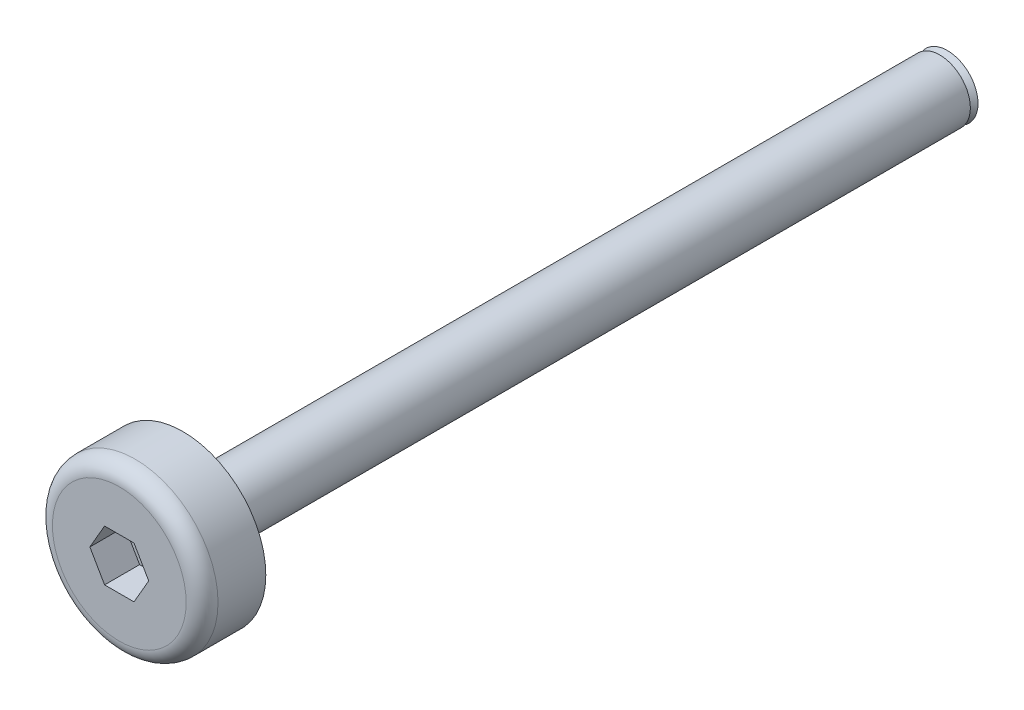
ISO-10303-21;
HEADER;
FILE_DESCRIPTION(('STEP AP214'),'2;1');
FILE_NAME('part.step','',(''),(''),'','','');
FILE_SCHEMA(('AUTOMOTIVE_DESIGN { 1 0 10303 214 1 1 1 1 }'));
ENDSEC;
DATA;
#1=APPLICATION_CONTEXT('core data for automotive mechanical design processes');
#2=APPLICATION_PROTOCOL_DEFINITION('international standard','automotive_design',2000,#1);
#3=PRODUCT_CONTEXT('',#1,'mechanical');
#4=PRODUCT('Part','Part','',(#3));
#5=PRODUCT_RELATED_PRODUCT_CATEGORY('part','',(#4));
#6=PRODUCT_DEFINITION_FORMATION('','',#4);
#7=PRODUCT_DEFINITION_CONTEXT('part definition',#1,'design');
#8=PRODUCT_DEFINITION('design','',#6,#7);
#9=PRODUCT_DEFINITION_SHAPE('','',#8);
#10=(LENGTH_UNIT() NAMED_UNIT(*) SI_UNIT(.MILLI.,.METRE.));
#11=(NAMED_UNIT(*) PLANE_ANGLE_UNIT() SI_UNIT($,.RADIAN.));
#12=(NAMED_UNIT(*) SI_UNIT($,.STERADIAN.) SOLID_ANGLE_UNIT());
#13=UNCERTAINTY_MEASURE_WITH_UNIT(LENGTH_MEASURE(1.E-05),#10,'distance_accuracy_value','');
#14=(GEOMETRIC_REPRESENTATION_CONTEXT(3) GLOBAL_UNCERTAINTY_ASSIGNED_CONTEXT((#13)) GLOBAL_UNIT_ASSIGNED_CONTEXT((#10,
#11,#12)) REPRESENTATION_CONTEXT('',''));
#15=CARTESIAN_POINT('',(0.,0.,0.));
#16=DIRECTION('',(0.,0.,1.));
#17=DIRECTION('',(1.,0.,0.));
#18=AXIS2_PLACEMENT_3D('',#15,#16,#17);
#19=CARTESIAN_POINT('',(0.,0.,-30.));
#20=DIRECTION('',(0.,0.,1.));
#21=DIRECTION('',(1.,0.,0.));
#22=AXIS2_PLACEMENT_3D('',#19,#20,#21);
#23=PLANE('',#22);
#24=CARTESIAN_POINT('',(0.,0.,-30.));
#25=DIRECTION('',(0.,0.,1.));
#26=DIRECTION('',(1.,0.,0.));
#27=AXIS2_PLACEMENT_3D('',#24,#25,#26);
#28=CIRCLE('',#27,1.2);
#29=CARTESIAN_POINT('',(1.2,0.,-30.));
#30=VERTEX_POINT('',#29);
#31=EDGE_CURVE('E9',#30,#30,#28,.T.);
#32=ORIENTED_EDGE('',*,*,#31,.F.);
#33=EDGE_LOOP('',(#32));
#34=FACE_BOUND('',#33,.T.);
#35=ADVANCED_FACE('F14',(#34),#23,.F.);
#36=CARTESIAN_POINT('',(0.,0.,-30.));
#37=DIRECTION('',(0.,0.,-1.));
#38=DIRECTION('',(1.,0.,0.));
#39=AXIS2_PLACEMENT_3D('',#36,#37,#38);
#40=CONICAL_SURFACE('',#39,1.2,0.785398163397);
#41=CARTESIAN_POINT('',(0.,0.,-29.7));
#42=DIRECTION('',(0.,0.,1.));
#43=DIRECTION('',(1.,0.,0.));
#44=AXIS2_PLACEMENT_3D('',#41,#42,#43);
#45=CIRCLE('',#44,0.9);
#46=CARTESIAN_POINT('',(0.9,0.,-29.7));
#47=VERTEX_POINT('',#46);
#48=EDGE_CURVE('E104',#47,#47,#45,.T.);
#49=ORIENTED_EDGE('',*,*,#48,.F.);
#50=DIRECTION('',(-0.707106781186548,0.,0.707106781186548));
#51=VECTOR('',#50,1.);
#52=CARTESIAN_POINT('',(1.2,0.,-30.));
#53=LINE('',#52,#51);
#54=EDGE_CURVE('E25',#30,#47,#53,.T.);
#55=ORIENTED_EDGE('',*,*,#54,.F.);
#56=ORIENTED_EDGE('',*,*,#31,.T.);
#57=ORIENTED_EDGE('',*,*,#54,.T.);
#58=EDGE_LOOP('',(#49,#55,#56,#57));
#59=FACE_BOUND('',#58,.T.);
#60=ADVANCED_FACE('F265',(#59),#40,.T.);
#61=CARTESIAN_POINT('',(0.,0.,1.125));
#62=DIRECTION('',(0.,0.,1.));
#63=DIRECTION('',(1.,0.,0.));
#64=AXIS2_PLACEMENT_3D('',#61,#62,#63);
#65=PLANE('',#64);
#66=DIRECTION('',(-0.50000000000019,0.866025403784329,0.));
#67=VECTOR('',#66,1.);
#68=CARTESIAN_POINT('',(1.154700538379,0.,1.125));
#69=LINE('',#68,#67);
#70=CARTESIAN_POINT('',(1.154700538379,0.,1.125));
#71=VERTEX_POINT('',#70);
#72=CARTESIAN_POINT('',(0.57735026919,1.,1.125));
#73=VERTEX_POINT('',#72);
#74=EDGE_CURVE('E197',#71,#73,#69,.T.);
#75=ORIENTED_EDGE('',*,*,#74,.T.);
#76=DIRECTION('',(-1.,0.,0.));
#77=VECTOR('',#76,1.);
#78=CARTESIAN_POINT('',(0.57735026919,1.,1.125));
#79=LINE('',#78,#77);
#80=CARTESIAN_POINT('',(-0.57735026919,1.,1.125));
#81=VERTEX_POINT('',#80);
#82=EDGE_CURVE('E121',#73,#81,#79,.T.);
#83=ORIENTED_EDGE('',*,*,#82,.T.);
#84=DIRECTION('',(-0.50000000000019,-0.866025403784329,0.));
#85=VECTOR('',#84,1.);
#86=CARTESIAN_POINT('',(-0.57735026919,1.,1.125));
#87=LINE('',#86,#85);
#88=CARTESIAN_POINT('',(-1.154700538379,0.,1.125));
#89=VERTEX_POINT('',#88);
#90=EDGE_CURVE('E161',#81,#89,#87,.T.);
#91=ORIENTED_EDGE('',*,*,#90,.T.);
#92=DIRECTION('',(0.50000000000019,-0.866025403784329,0.));
#93=VECTOR('',#92,1.);
#94=CARTESIAN_POINT('',(-1.154700538379,0.,1.125));
#95=LINE('',#94,#93);
#96=CARTESIAN_POINT('',(-0.57735026919,-1.,1.125));
#97=VERTEX_POINT('',#96);
#98=EDGE_CURVE('E166',#89,#97,#95,.T.);
#99=ORIENTED_EDGE('',*,*,#98,.T.);
#100=DIRECTION('',(1.,0.,0.));
#101=VECTOR('',#100,1.);
#102=CARTESIAN_POINT('',(-0.57735026919,-1.,1.125));
#103=LINE('',#102,#101);
#104=CARTESIAN_POINT('',(0.57735026919,-1.,1.125));
#105=VERTEX_POINT('',#104);
#106=EDGE_CURVE('E117',#97,#105,#103,.T.);
#107=ORIENTED_EDGE('',*,*,#106,.T.);
#108=DIRECTION('',(0.50000000000019,0.866025403784329,0.));
#109=VECTOR('',#108,1.);
#110=CARTESIAN_POINT('',(0.57735026919,-1.,1.125));
#111=LINE('',#110,#109);
#112=EDGE_CURVE('E116',#105,#71,#111,.T.);
#113=ORIENTED_EDGE('',*,*,#112,.T.);
#114=EDGE_LOOP('',(#75,#83,#91,#99,#107,#113));
#115=FACE_BOUND('',#114,.T.);
#116=ADVANCED_FACE('F203',(#115),#65,.T.);
#117=CARTESIAN_POINT('',(0.,0.,-29.7));
#118=DIRECTION('',(0.,0.,1.));
#119=DIRECTION('',(1.,0.,0.));
#120=AXIS2_PLACEMENT_3D('',#117,#118,#119);
#121=PLANE('',#120);
#122=ORIENTED_EDGE('',*,*,#48,.T.);
#123=EDGE_LOOP('',(#122));
#124=FACE_BOUND('',#123,.T.);
#125=CARTESIAN_POINT('',(0.,0.,-29.7));
#126=DIRECTION('',(0.,0.,1.));
#127=DIRECTION('',(1.,0.,0.));
#128=AXIS2_PLACEMENT_3D('',#125,#126,#127);
#129=CIRCLE('',#128,1.2);
#130=CARTESIAN_POINT('',(1.2,0.,-29.7));
#131=VERTEX_POINT('',#130);
#132=EDGE_CURVE('E18',#131,#131,#129,.T.);
#133=ORIENTED_EDGE('',*,*,#132,.F.);
#134=EDGE_LOOP('',(#133));
#135=FACE_BOUND('',#134,.T.);
#136=ADVANCED_FACE('F274',(#124,#135),#121,.F.);
#137=CARTESIAN_POINT('',(1.154700538379,0.,1.125));
#138=DIRECTION('',(-0.866025403784329,-0.50000000000019,0.));
#139=DIRECTION('',(-0.50000000000019,0.866025403784329,0.));
#140=AXIS2_PLACEMENT_3D('',#137,#138,#139);
#141=PLANE('',#140);
#142=ORIENTED_EDGE('',*,*,#74,.F.);
#143=DIRECTION('',(0.,0.,1.));
#144=VECTOR('',#143,1.);
#145=CARTESIAN_POINT('',(1.154700538379,0.,1.125));
#146=LINE('',#145,#144);
#147=CARTESIAN_POINT('',(1.154700538379,0.,2.5));
#148=VERTEX_POINT('',#147);
#149=EDGE_CURVE('E157',#71,#148,#146,.T.);
#150=ORIENTED_EDGE('',*,*,#149,.T.);
#151=DIRECTION('',(0.50000000000019,-0.866025403784329,0.));
#152=VECTOR('',#151,1.);
#153=CARTESIAN_POINT('',(1.010362971082,0.25,2.5));
#154=LINE('',#153,#152);
#155=CARTESIAN_POINT('',(0.57735026919,1.,2.5));
#156=VERTEX_POINT('',#155);
#157=EDGE_CURVE('E120',#156,#148,#154,.T.);
#158=ORIENTED_EDGE('',*,*,#157,.F.);
#159=DIRECTION('',(0.,0.,1.));
#160=VECTOR('',#159,1.);
#161=CARTESIAN_POINT('',(0.57735026919,1.,1.125));
#162=LINE('',#161,#160);
#163=EDGE_CURVE('E124',#73,#156,#162,.T.);
#164=ORIENTED_EDGE('',*,*,#163,.F.);
#165=EDGE_LOOP('',(#142,#150,#158,#164));
#166=FACE_BOUND('',#165,.T.);
#167=ADVANCED_FACE('F244',(#166),#141,.T.);
#168=CARTESIAN_POINT('',(0.57735026919,-1.,1.125));
#169=DIRECTION('',(-0.866025403784329,0.50000000000019,0.));
#170=DIRECTION('',(0.,0.,1.));
#171=AXIS2_PLACEMENT_3D('',#168,#169,#170);
#172=PLANE('',#171);
#173=ORIENTED_EDGE('',*,*,#112,.F.);
#174=DIRECTION('',(0.,0.,1.));
#175=VECTOR('',#174,1.);
#176=CARTESIAN_POINT('',(0.57735026919,-1.,1.125));
#177=LINE('',#176,#175);
#178=CARTESIAN_POINT('',(0.57735026919,-1.,2.5));
#179=VERTEX_POINT('',#178);
#180=EDGE_CURVE('E112',#105,#179,#177,.T.);
#181=ORIENTED_EDGE('',*,*,#180,.T.);
#182=DIRECTION('',(-0.50000000000019,-0.866025403784329,0.));
#183=VECTOR('',#182,1.);
#184=CARTESIAN_POINT('',(0.721687836487,-0.75,2.5));
#185=LINE('',#184,#183);
#186=EDGE_CURVE('E151',#148,#179,#185,.T.);
#187=ORIENTED_EDGE('',*,*,#186,.F.);
#188=ORIENTED_EDGE('',*,*,#149,.F.);
#189=EDGE_LOOP('',(#173,#181,#187,#188));
#190=FACE_BOUND('',#189,.T.);
#191=ADVANCED_FACE('F246',(#190),#172,.T.);
#192=CARTESIAN_POINT('',(-0.57735026919,-1.,1.125));
#193=DIRECTION('',(0.,1.,0.));
#194=DIRECTION('',(1.,0.,0.));
#195=AXIS2_PLACEMENT_3D('',#192,#193,#194);
#196=PLANE('',#195);
#197=ORIENTED_EDGE('',*,*,#106,.F.);
#198=DIRECTION('',(0.,0.,1.));
#199=VECTOR('',#198,1.);
#200=CARTESIAN_POINT('',(-0.57735026919,-1.,1.125));
#201=LINE('',#200,#199);
#202=CARTESIAN_POINT('',(-0.57735026919,-1.,2.5));
#203=VERTEX_POINT('',#202);
#204=EDGE_CURVE('E162',#97,#203,#201,.T.);
#205=ORIENTED_EDGE('',*,*,#204,.T.);
#206=DIRECTION('',(-1.,0.,0.));
#207=VECTOR('',#206,1.);
#208=CARTESIAN_POINT('',(-0.288675134595,-1.,2.5));
#209=LINE('',#208,#207);
#210=EDGE_CURVE('E111',#179,#203,#209,.T.);
#211=ORIENTED_EDGE('',*,*,#210,.F.);
#212=ORIENTED_EDGE('',*,*,#180,.F.);
#213=EDGE_LOOP('',(#197,#205,#211,#212));
#214=FACE_BOUND('',#213,.T.);
#215=ADVANCED_FACE('F276',(#214),#196,.T.);
#216=CARTESIAN_POINT('',(-1.154700538379,0.,1.125));
#217=DIRECTION('',(0.866025403784329,0.50000000000019,0.));
#218=DIRECTION('',(0.,0.,-1.));
#219=AXIS2_PLACEMENT_3D('',#216,#217,#218);
#220=PLANE('',#219);
#221=ORIENTED_EDGE('',*,*,#98,.F.);
#222=DIRECTION('',(0.,0.,1.));
#223=VECTOR('',#222,1.);
#224=CARTESIAN_POINT('',(-1.154700538379,0.,1.125));
#225=LINE('',#224,#223);
#226=CARTESIAN_POINT('',(-1.154700538379,0.,2.5));
#227=VERTEX_POINT('',#226);
#228=EDGE_CURVE('E186',#89,#227,#225,.T.);
#229=ORIENTED_EDGE('',*,*,#228,.T.);
#230=DIRECTION('',(-0.50000000000019,0.866025403784329,0.));
#231=VECTOR('',#230,1.);
#232=CARTESIAN_POINT('',(-1.010362971082,-0.25,2.5));
#233=LINE('',#232,#231);
#234=EDGE_CURVE('E106',#203,#227,#233,.T.);
#235=ORIENTED_EDGE('',*,*,#234,.F.);
#236=ORIENTED_EDGE('',*,*,#204,.F.);
#237=EDGE_LOOP('',(#221,#229,#235,#236));
#238=FACE_BOUND('',#237,.T.);
#239=ADVANCED_FACE('F208',(#238),#220,.T.);
#240=CARTESIAN_POINT('',(-0.57735026919,1.,1.125));
#241=DIRECTION('',(0.866025403784329,-0.50000000000019,0.));
#242=DIRECTION('',(0.,0.,-1.));
#243=AXIS2_PLACEMENT_3D('',#240,#241,#242);
#244=PLANE('',#243);
#245=ORIENTED_EDGE('',*,*,#90,.F.);
#246=DIRECTION('',(0.,0.,1.));
#247=VECTOR('',#246,1.);
#248=CARTESIAN_POINT('',(-0.57735026919,1.,1.125));
#249=LINE('',#248,#247);
#250=CARTESIAN_POINT('',(-0.57735026919,1.,2.5));
#251=VERTEX_POINT('',#250);
#252=EDGE_CURVE('E133',#81,#251,#249,.T.);
#253=ORIENTED_EDGE('',*,*,#252,.T.);
#254=DIRECTION('',(0.50000000000019,0.866025403784329,0.));
#255=VECTOR('',#254,1.);
#256=CARTESIAN_POINT('',(-0.721687836487,0.75,2.5));
#257=LINE('',#256,#255);
#258=EDGE_CURVE('E110',#227,#251,#257,.T.);
#259=ORIENTED_EDGE('',*,*,#258,.F.);
#260=ORIENTED_EDGE('',*,*,#228,.F.);
#261=EDGE_LOOP('',(#245,#253,#259,#260));
#262=FACE_BOUND('',#261,.T.);
#263=ADVANCED_FACE('F212',(#262),#244,.T.);
#264=CARTESIAN_POINT('',(0.57735026919,1.,1.125));
#265=DIRECTION('',(0.,-1.,0.));
#266=DIRECTION('',(-1.,0.,0.));
#267=AXIS2_PLACEMENT_3D('',#264,#265,#266);
#268=PLANE('',#267);
#269=ORIENTED_EDGE('',*,*,#82,.F.);
#270=ORIENTED_EDGE('',*,*,#163,.T.);
#271=DIRECTION('',(1.,0.,0.));
#272=VECTOR('',#271,1.);
#273=CARTESIAN_POINT('',(0.288675134595,1.,2.5));
#274=LINE('',#273,#272);
#275=EDGE_CURVE('E98',#251,#156,#274,.T.);
#276=ORIENTED_EDGE('',*,*,#275,.F.);
#277=ORIENTED_EDGE('',*,*,#252,.F.);
#278=EDGE_LOOP('',(#269,#270,#276,#277));
#279=FACE_BOUND('',#278,.T.);
#280=ADVANCED_FACE('F252',(#279),#268,.T.);
#281=CARTESIAN_POINT('',(0.,0.,-29.7));
#282=DIRECTION('',(0.,0.,1.));
#283=DIRECTION('',(1.,0.,0.));
#284=AXIS2_PLACEMENT_3D('',#281,#282,#283);
#285=CYLINDRICAL_SURFACE('',#284,1.2);
#286=CARTESIAN_POINT('',(0.,0.,0.));
#287=DIRECTION('',(0.,0.,1.));
#288=DIRECTION('',(1.,0.,0.));
#289=AXIS2_PLACEMENT_3D('',#286,#287,#288);
#290=CIRCLE('',#289,1.2);
#291=CARTESIAN_POINT('',(1.2,0.,0.));
#292=VERTEX_POINT('',#291);
#293=EDGE_CURVE('E89',#292,#292,#290,.T.);
#294=ORIENTED_EDGE('',*,*,#293,.F.);
#295=DIRECTION('',(0.,0.,1.));
#296=VECTOR('',#295,1.);
#297=CARTESIAN_POINT('',(1.2,0.,-29.7));
#298=LINE('',#297,#296);
#299=EDGE_CURVE('E136',#131,#292,#298,.T.);
#300=ORIENTED_EDGE('',*,*,#299,.F.);
#301=ORIENTED_EDGE('',*,*,#132,.T.);
#302=ORIENTED_EDGE('',*,*,#299,.T.);
#303=EDGE_LOOP('',(#294,#300,#301,#302));
#304=FACE_BOUND('',#303,.T.);
#305=ADVANCED_FACE('F254',(#304),#285,.T.);
#306=CARTESIAN_POINT('',(0.,0.,2.5));
#307=DIRECTION('',(0.,0.,1.));
#308=DIRECTION('',(1.,0.,0.));
#309=AXIS2_PLACEMENT_3D('',#306,#307,#308);
#310=PLANE('',#309);
#311=ORIENTED_EDGE('',*,*,#275,.T.);
#312=ORIENTED_EDGE('',*,*,#157,.T.);
#313=ORIENTED_EDGE('',*,*,#186,.T.);
#314=ORIENTED_EDGE('',*,*,#210,.T.);
#315=ORIENTED_EDGE('',*,*,#234,.T.);
#316=ORIENTED_EDGE('',*,*,#258,.T.);
#317=EDGE_LOOP('',(#311,#312,#313,#314,#315,#316));
#318=FACE_BOUND('',#317,.T.);
#319=CARTESIAN_POINT('',(0.,0.,2.5));
#320=DIRECTION('',(0.,0.,1.));
#321=DIRECTION('',(1.,0.,0.));
#322=AXIS2_PLACEMENT_3D('',#319,#320,#321);
#323=CIRCLE('',#322,2.625);
#324=CARTESIAN_POINT('',(2.625,0.,2.5));
#325=VERTEX_POINT('',#324);
#326=EDGE_CURVE('E85',#325,#325,#323,.T.);
#327=ORIENTED_EDGE('',*,*,#326,.T.);
#328=EDGE_LOOP('',(#327));
#329=FACE_BOUND('',#328,.T.);
#330=ADVANCED_FACE('F16',(#318,#329),#310,.T.);
#331=CARTESIAN_POINT('',(0.,0.,0.));
#332=DIRECTION('',(0.,0.,1.));
#333=DIRECTION('',(1.,0.,0.));
#334=AXIS2_PLACEMENT_3D('',#331,#332,#333);
#335=PLANE('',#334);
#336=ORIENTED_EDGE('',*,*,#293,.T.);
#337=EDGE_LOOP('',(#336));
#338=FACE_BOUND('',#337,.T.);
#339=CARTESIAN_POINT('',(0.,0.,0.));
#340=DIRECTION('',(0.,0.,1.));
#341=DIRECTION('',(1.,0.,0.));
#342=AXIS2_PLACEMENT_3D('',#339,#340,#341);
#343=CIRCLE('',#342,3.25);
#344=CARTESIAN_POINT('',(3.25,0.,0.));
#345=VERTEX_POINT('',#344);
#346=EDGE_CURVE('E100',#345,#345,#343,.T.);
#347=ORIENTED_EDGE('',*,*,#346,.F.);
#348=EDGE_LOOP('',(#347));
#349=FACE_BOUND('',#348,.T.);
#350=ADVANCED_FACE('F286',(#338,#349),#335,.F.);
#351=CARTESIAN_POINT('',(0.,0.,1.875));
#352=DIRECTION('',(0.,0.,1.));
#353=DIRECTION('',(1.,0.,0.));
#354=AXIS2_PLACEMENT_3D('',#351,#352,#353);
#355=TOROIDAL_SURFACE('',#354,2.625,0.625);
#356=CARTESIAN_POINT('',(2.625,0.,1.875));
#357=DIRECTION('',(0.,-1.,0.));
#358=DIRECTION('',(1.,0.,0.));
#359=AXIS2_PLACEMENT_3D('',#356,#357,#358);
#360=CIRCLE('',#359,0.625);
#361=CARTESIAN_POINT('',(3.25,0.,1.875));
#362=VERTEX_POINT('',#361);
#363=EDGE_CURVE('E90',#362,#325,#360,.T.);
#364=ORIENTED_EDGE('',*,*,#363,.F.);
#365=CARTESIAN_POINT('',(0.,0.,1.875));
#366=DIRECTION('',(0.,0.,1.));
#367=DIRECTION('',(1.,0.,0.));
#368=AXIS2_PLACEMENT_3D('',#365,#366,#367);
#369=CIRCLE('',#368,3.25);
#370=EDGE_CURVE('E170',#362,#362,#369,.T.);
#371=ORIENTED_EDGE('',*,*,#370,.T.);
#372=ORIENTED_EDGE('',*,*,#363,.T.);
#373=ORIENTED_EDGE('',*,*,#326,.F.);
#374=EDGE_LOOP('',(#364,#371,#372,#373));
#375=FACE_BOUND('',#374,.T.);
#376=ADVANCED_FACE('F282',(#375),#355,.T.);
#377=CARTESIAN_POINT('',(0.,0.,0.));
#378=DIRECTION('',(0.,0.,1.));
#379=DIRECTION('',(1.,0.,0.));
#380=AXIS2_PLACEMENT_3D('',#377,#378,#379);
#381=CYLINDRICAL_SURFACE('',#380,3.25);
#382=DIRECTION('',(0.,0.,1.));
#383=VECTOR('',#382,1.);
#384=CARTESIAN_POINT('',(3.25,0.,0.));
#385=LINE('',#384,#383);
#386=EDGE_CURVE('E173',#345,#362,#385,.T.);
#387=ORIENTED_EDGE('',*,*,#386,.T.);
#388=ORIENTED_EDGE('',*,*,#370,.F.);
#389=ORIENTED_EDGE('',*,*,#386,.F.);
#390=ORIENTED_EDGE('',*,*,#346,.T.);
#391=EDGE_LOOP('',(#387,#388,#389,#390));
#392=FACE_BOUND('',#391,.T.);
#393=ADVANCED_FACE('F285',(#392),#381,.T.);
#394=CLOSED_SHELL('',(#35,#60,#116,#136,#167,#191,#215,#239,#263,#280,#305,#330,#350,#376,#393));
#395=MANIFOLD_SOLID_BREP('B1',#394);
#396=ADVANCED_BREP_SHAPE_REPRESENTATION('',(#18,#395),#14);
#397=SHAPE_DEFINITION_REPRESENTATION(#9,#396);
ENDSEC;
END-ISO-10303-21;
